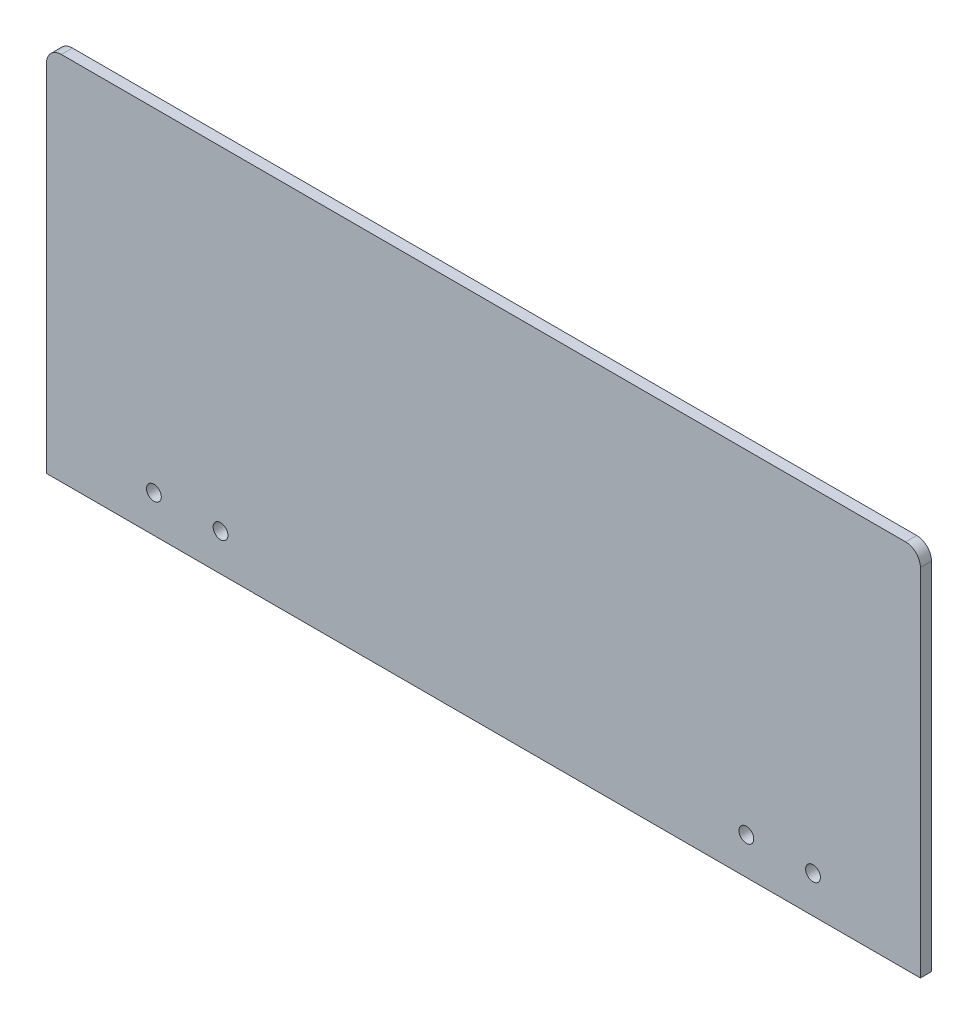
ISO-10303-21;
HEADER;
FILE_DESCRIPTION(('STEP AP214'),'2;1');
FILE_NAME('part.step','',(''),(''),'','','');
FILE_SCHEMA(('AUTOMOTIVE_DESIGN { 1 0 10303 214 1 1 1 1 }'));
ENDSEC;
DATA;
#1=APPLICATION_CONTEXT('core data for automotive mechanical design processes');
#2=APPLICATION_PROTOCOL_DEFINITION('international standard','automotive_design',2000,#1);
#3=PRODUCT_CONTEXT('',#1,'mechanical');
#4=PRODUCT('Part','Part','',(#3));
#5=PRODUCT_RELATED_PRODUCT_CATEGORY('part','',(#4));
#6=PRODUCT_DEFINITION_FORMATION('','',#4);
#7=PRODUCT_DEFINITION_CONTEXT('part definition',#1,'design');
#8=PRODUCT_DEFINITION('design','',#6,#7);
#9=PRODUCT_DEFINITION_SHAPE('','',#8);
#10=(LENGTH_UNIT() NAMED_UNIT(*) SI_UNIT(.MILLI.,.METRE.));
#11=(NAMED_UNIT(*) PLANE_ANGLE_UNIT() SI_UNIT($,.RADIAN.));
#12=(NAMED_UNIT(*) SI_UNIT($,.STERADIAN.) SOLID_ANGLE_UNIT());
#13=UNCERTAINTY_MEASURE_WITH_UNIT(LENGTH_MEASURE(1.E-05),#10,'distance_accuracy_value','');
#14=(GEOMETRIC_REPRESENTATION_CONTEXT(3) GLOBAL_UNCERTAINTY_ASSIGNED_CONTEXT((#13)) GLOBAL_UNIT_ASSIGNED_CONTEXT((#10,
#11,#12)) REPRESENTATION_CONTEXT('',''));
#15=CARTESIAN_POINT('',(0.,0.,0.));
#16=DIRECTION('',(0.,0.,1.));
#17=DIRECTION('',(1.,0.,0.));
#18=AXIS2_PLACEMENT_3D('',#15,#16,#17);
#19=CARTESIAN_POINT('',(-118.,-55.,3.));
#20=DIRECTION('',(1.,0.,0.));
#21=DIRECTION('',(0.,1.,0.));
#22=AXIS2_PLACEMENT_3D('',#19,#20,#21);
#23=PLANE('',#22);
#24=DIRECTION('',(0.,-1.,0.));
#25=VECTOR('',#24,1.);
#26=CARTESIAN_POINT('',(-118.,-55.,3.));
#27=LINE('',#26,#25);
#28=CARTESIAN_POINT('',(-118.,-59.,3.));
#29=VERTEX_POINT('',#28);
#30=CARTESIAN_POINT('',(-118.,-155.,3.));
#31=VERTEX_POINT('',#30);
#32=EDGE_CURVE('E92',#29,#31,#27,.T.);
#33=ORIENTED_EDGE('',*,*,#32,.F.);
#34=DIRECTION('',(0.,0.,-1.));
#35=VECTOR('',#34,1.);
#36=CARTESIAN_POINT('',(-118.,-59.,3.));
#37=LINE('',#36,#35);
#38=CARTESIAN_POINT('',(-118.,-59.,0.));
#39=VERTEX_POINT('',#38);
#40=EDGE_CURVE('E11',#29,#39,#37,.T.);
#41=ORIENTED_EDGE('',*,*,#40,.T.);
#42=DIRECTION('',(0.,-1.,0.));
#43=VECTOR('',#42,1.);
#44=CARTESIAN_POINT('',(-118.,-55.,0.));
#45=LINE('',#44,#43);
#46=CARTESIAN_POINT('',(-118.,-155.,0.));
#47=VERTEX_POINT('',#46);
#48=EDGE_CURVE('E111',#39,#47,#45,.T.);
#49=ORIENTED_EDGE('',*,*,#48,.T.);
#50=DIRECTION('',(0.,0.,-1.));
#51=VECTOR('',#50,1.);
#52=CARTESIAN_POINT('',(-118.,-155.,3.));
#53=LINE('',#52,#51);
#54=EDGE_CURVE('E105',#31,#47,#53,.T.);
#55=ORIENTED_EDGE('',*,*,#54,.F.);
#56=EDGE_LOOP('',(#33,#41,#49,#55));
#57=FACE_BOUND('',#56,.T.);
#58=ADVANCED_FACE('F39',(#57),#23,.F.);
#59=CARTESIAN_POINT('',(118.,-155.,3.));
#60=DIRECTION('',(0.,1.,0.));
#61=DIRECTION('',(-1.,0.,0.));
#62=AXIS2_PLACEMENT_3D('',#59,#60,#61);
#63=PLANE('',#62);
#64=DIRECTION('',(1.,0.,0.));
#65=VECTOR('',#64,1.);
#66=CARTESIAN_POINT('',(118.,-155.,0.));
#67=LINE('',#66,#65);
#68=CARTESIAN_POINT('',(118.,-155.,0.));
#69=VERTEX_POINT('',#68);
#70=EDGE_CURVE('E144',#47,#69,#67,.T.);
#71=ORIENTED_EDGE('',*,*,#70,.T.);
#72=DIRECTION('',(0.,0.,-1.));
#73=VECTOR('',#72,1.);
#74=CARTESIAN_POINT('',(118.,-155.,3.));
#75=LINE('',#74,#73);
#76=CARTESIAN_POINT('',(118.,-155.,3.));
#77=VERTEX_POINT('',#76);
#78=EDGE_CURVE('E107',#77,#69,#75,.T.);
#79=ORIENTED_EDGE('',*,*,#78,.F.);
#80=DIRECTION('',(1.,0.,0.));
#81=VECTOR('',#80,1.);
#82=CARTESIAN_POINT('',(118.,-155.,3.));
#83=LINE('',#82,#81);
#84=EDGE_CURVE('E95',#31,#77,#83,.T.);
#85=ORIENTED_EDGE('',*,*,#84,.F.);
#86=ORIENTED_EDGE('',*,*,#54,.T.);
#87=EDGE_LOOP('',(#71,#79,#85,#86));
#88=FACE_BOUND('',#87,.T.);
#89=ADVANCED_FACE('F104',(#88),#63,.F.);
#90=CARTESIAN_POINT('',(118.,-55.,3.));
#91=DIRECTION('',(-1.,0.,0.));
#92=DIRECTION('',(0.,-1.,0.));
#93=AXIS2_PLACEMENT_3D('',#90,#91,#92);
#94=PLANE('',#93);
#95=DIRECTION('',(0.,1.,0.));
#96=VECTOR('',#95,1.);
#97=CARTESIAN_POINT('',(118.,-55.,0.));
#98=LINE('',#97,#96);
#99=CARTESIAN_POINT('',(118.,-59.,0.));
#100=VERTEX_POINT('',#99);
#101=EDGE_CURVE('E142',#69,#100,#98,.T.);
#102=ORIENTED_EDGE('',*,*,#101,.T.);
#103=DIRECTION('',(0.,0.,-1.));
#104=VECTOR('',#103,1.);
#105=CARTESIAN_POINT('',(118.,-59.,3.));
#106=LINE('',#105,#104);
#107=CARTESIAN_POINT('',(118.,-59.,3.));
#108=VERTEX_POINT('',#107);
#109=EDGE_CURVE('E62',#100,#108,#106,.F.);
#110=ORIENTED_EDGE('',*,*,#109,.T.);
#111=DIRECTION('',(0.,1.,0.));
#112=VECTOR('',#111,1.);
#113=CARTESIAN_POINT('',(118.,-55.,3.));
#114=LINE('',#113,#112);
#115=EDGE_CURVE('E108',#77,#108,#114,.T.);
#116=ORIENTED_EDGE('',*,*,#115,.F.);
#117=ORIENTED_EDGE('',*,*,#78,.T.);
#118=EDGE_LOOP('',(#102,#110,#116,#117));
#119=FACE_BOUND('',#118,.T.);
#120=ADVANCED_FACE('F143',(#119),#94,.F.);
#121=CARTESIAN_POINT('',(-118.,-55.,3.));
#122=DIRECTION('',(0.,-1.,0.));
#123=DIRECTION('',(0.,0.,-1.));
#124=AXIS2_PLACEMENT_3D('',#121,#122,#123);
#125=PLANE('',#124);
#126=DIRECTION('',(-1.,0.,0.));
#127=VECTOR('',#126,1.);
#128=CARTESIAN_POINT('',(-118.,-55.,3.));
#129=LINE('',#128,#127);
#130=CARTESIAN_POINT('',(114.,-55.,3.));
#131=VERTEX_POINT('',#130);
#132=CARTESIAN_POINT('',(-114.,-55.,3.));
#133=VERTEX_POINT('',#132);
#134=EDGE_CURVE('E117',#131,#133,#129,.T.);
#135=ORIENTED_EDGE('',*,*,#134,.F.);
#136=DIRECTION('',(0.,0.,-1.));
#137=VECTOR('',#136,1.);
#138=CARTESIAN_POINT('',(114.,-55.,3.));
#139=LINE('',#138,#137);
#140=CARTESIAN_POINT('',(114.,-55.,0.));
#141=VERTEX_POINT('',#140);
#142=EDGE_CURVE('E115',#131,#141,#139,.T.);
#143=ORIENTED_EDGE('',*,*,#142,.T.);
#144=DIRECTION('',(-1.,0.,0.));
#145=VECTOR('',#144,1.);
#146=CARTESIAN_POINT('',(-118.,-55.,0.));
#147=LINE('',#146,#145);
#148=CARTESIAN_POINT('',(-114.,-55.,0.));
#149=VERTEX_POINT('',#148);
#150=EDGE_CURVE('E100',#141,#149,#147,.T.);
#151=ORIENTED_EDGE('',*,*,#150,.T.);
#152=DIRECTION('',(0.,0.,-1.));
#153=VECTOR('',#152,1.);
#154=CARTESIAN_POINT('',(-114.,-55.,3.));
#155=LINE('',#154,#153);
#156=EDGE_CURVE('E113',#149,#133,#155,.F.);
#157=ORIENTED_EDGE('',*,*,#156,.T.);
#158=EDGE_LOOP('',(#135,#143,#151,#157));
#159=FACE_BOUND('',#158,.T.);
#160=ADVANCED_FACE('F133',(#159),#125,.F.);
#161=CARTESIAN_POINT('',(0.,0.,3.));
#162=DIRECTION('',(0.,0.,-1.));
#163=DIRECTION('',(-1.,0.,0.));
#164=AXIS2_PLACEMENT_3D('',#161,#162,#163);
#165=PLANE('',#164);
#166=CARTESIAN_POINT('',(71.,-145.,3.));
#167=DIRECTION('',(0.,0.,-1.));
#168=DIRECTION('',(-1.,0.,0.));
#169=AXIS2_PLACEMENT_3D('',#166,#167,#168);
#170=CIRCLE('',#169,2.);
#171=CARTESIAN_POINT('',(73.,-145.,3.));
#172=VERTEX_POINT('',#171);
#173=EDGE_CURVE('E166',#172,#172,#170,.T.);
#174=ORIENTED_EDGE('',*,*,#173,.T.);
#175=EDGE_LOOP('',(#174));
#176=FACE_BOUND('',#175,.T.);
#177=CARTESIAN_POINT('',(89.,-145.,3.));
#178=DIRECTION('',(0.,0.,-1.));
#179=DIRECTION('',(-1.,0.,0.));
#180=AXIS2_PLACEMENT_3D('',#177,#178,#179);
#181=CIRCLE('',#180,2.);
#182=CARTESIAN_POINT('',(91.,-145.,3.));
#183=VERTEX_POINT('',#182);
#184=EDGE_CURVE('E167',#183,#183,#181,.T.);
#185=ORIENTED_EDGE('',*,*,#184,.T.);
#186=EDGE_LOOP('',(#185));
#187=FACE_BOUND('',#186,.T.);
#188=CARTESIAN_POINT('',(-71.,-145.,3.));
#189=DIRECTION('',(0.,0.,1.));
#190=DIRECTION('',(1.,0.,0.));
#191=AXIS2_PLACEMENT_3D('',#188,#189,#190);
#192=CIRCLE('',#191,2.);
#193=CARTESIAN_POINT('',(-69.,-145.,3.));
#194=VERTEX_POINT('',#193);
#195=EDGE_CURVE('E148',#194,#194,#192,.T.);
#196=ORIENTED_EDGE('',*,*,#195,.F.);
#197=EDGE_LOOP('',(#196));
#198=FACE_BOUND('',#197,.T.);
#199=CARTESIAN_POINT('',(-89.,-145.,3.));
#200=DIRECTION('',(0.,0.,1.));
#201=DIRECTION('',(1.,0.,0.));
#202=AXIS2_PLACEMENT_3D('',#199,#200,#201);
#203=CIRCLE('',#202,2.);
#204=CARTESIAN_POINT('',(-87.,-145.,3.));
#205=VERTEX_POINT('',#204);
#206=EDGE_CURVE('E154',#205,#205,#203,.T.);
#207=ORIENTED_EDGE('',*,*,#206,.F.);
#208=EDGE_LOOP('',(#207));
#209=FACE_BOUND('',#208,.T.);
#210=ORIENTED_EDGE('',*,*,#115,.T.);
#211=CARTESIAN_POINT('',(114.,-59.,3.));
#212=DIRECTION('',(0.,0.,-1.));
#213=DIRECTION('',(-1.,0.,0.));
#214=AXIS2_PLACEMENT_3D('',#211,#212,#213);
#215=CIRCLE('',#214,4.);
#216=EDGE_CURVE('E47',#108,#131,#215,.F.);
#217=ORIENTED_EDGE('',*,*,#216,.T.);
#218=ORIENTED_EDGE('',*,*,#134,.T.);
#219=CARTESIAN_POINT('',(-114.,-59.,3.));
#220=DIRECTION('',(0.,0.,-1.));
#221=DIRECTION('',(-1.,0.,0.));
#222=AXIS2_PLACEMENT_3D('',#219,#220,#221);
#223=CIRCLE('',#222,4.);
#224=EDGE_CURVE('E54',#133,#29,#223,.F.);
#225=ORIENTED_EDGE('',*,*,#224,.T.);
#226=ORIENTED_EDGE('',*,*,#32,.T.);
#227=ORIENTED_EDGE('',*,*,#84,.T.);
#228=EDGE_LOOP('',(#210,#217,#218,#225,#226,#227));
#229=FACE_BOUND('',#228,.T.);
#230=ADVANCED_FACE('F94',(#176,#187,#198,#209,#229),#165,.F.);
#231=CARTESIAN_POINT('',(0.,0.,0.));
#232=DIRECTION('',(0.,0.,-1.));
#233=DIRECTION('',(-1.,0.,0.));
#234=AXIS2_PLACEMENT_3D('',#231,#232,#233);
#235=PLANE('',#234);
#236=CARTESIAN_POINT('',(71.,-145.,0.));
#237=DIRECTION('',(0.,0.,-1.));
#238=DIRECTION('',(-1.,0.,0.));
#239=AXIS2_PLACEMENT_3D('',#236,#237,#238);
#240=CIRCLE('',#239,2.);
#241=CARTESIAN_POINT('',(73.,-145.,0.));
#242=VERTEX_POINT('',#241);
#243=EDGE_CURVE('E155',#242,#242,#240,.T.);
#244=ORIENTED_EDGE('',*,*,#243,.F.);
#245=EDGE_LOOP('',(#244));
#246=FACE_BOUND('',#245,.T.);
#247=CARTESIAN_POINT('',(89.,-145.,0.));
#248=DIRECTION('',(0.,0.,-1.));
#249=DIRECTION('',(-1.,0.,0.));
#250=AXIS2_PLACEMENT_3D('',#247,#248,#249);
#251=CIRCLE('',#250,2.);
#252=CARTESIAN_POINT('',(91.,-145.,0.));
#253=VERTEX_POINT('',#252);
#254=EDGE_CURVE('E163',#253,#253,#251,.T.);
#255=ORIENTED_EDGE('',*,*,#254,.F.);
#256=EDGE_LOOP('',(#255));
#257=FACE_BOUND('',#256,.T.);
#258=CARTESIAN_POINT('',(-71.,-145.,0.));
#259=DIRECTION('',(0.,0.,-1.));
#260=DIRECTION('',(-1.,0.,0.));
#261=AXIS2_PLACEMENT_3D('',#258,#259,#260);
#262=CIRCLE('',#261,2.);
#263=CARTESIAN_POINT('',(-69.,-145.,0.));
#264=VERTEX_POINT('',#263);
#265=EDGE_CURVE('E158',#264,#264,#262,.F.);
#266=ORIENTED_EDGE('',*,*,#265,.T.);
#267=EDGE_LOOP('',(#266));
#268=FACE_BOUND('',#267,.T.);
#269=CARTESIAN_POINT('',(-89.,-145.,0.));
#270=DIRECTION('',(0.,0.,-1.));
#271=DIRECTION('',(-1.,0.,0.));
#272=AXIS2_PLACEMENT_3D('',#269,#270,#271);
#273=CIRCLE('',#272,2.);
#274=CARTESIAN_POINT('',(-87.,-145.,0.));
#275=VERTEX_POINT('',#274);
#276=EDGE_CURVE('E151',#275,#275,#273,.F.);
#277=ORIENTED_EDGE('',*,*,#276,.T.);
#278=EDGE_LOOP('',(#277));
#279=FACE_BOUND('',#278,.T.);
#280=ORIENTED_EDGE('',*,*,#150,.F.);
#281=CARTESIAN_POINT('',(114.,-59.,0.));
#282=DIRECTION('',(0.,0.,-1.));
#283=DIRECTION('',(-1.,0.,0.));
#284=AXIS2_PLACEMENT_3D('',#281,#282,#283);
#285=CIRCLE('',#284,4.);
#286=EDGE_CURVE('E125',#141,#100,#285,.T.);
#287=ORIENTED_EDGE('',*,*,#286,.T.);
#288=ORIENTED_EDGE('',*,*,#101,.F.);
#289=ORIENTED_EDGE('',*,*,#70,.F.);
#290=ORIENTED_EDGE('',*,*,#48,.F.);
#291=CARTESIAN_POINT('',(-114.,-59.,0.));
#292=DIRECTION('',(0.,0.,-1.));
#293=DIRECTION('',(-1.,0.,0.));
#294=AXIS2_PLACEMENT_3D('',#291,#292,#293);
#295=CIRCLE('',#294,4.);
#296=EDGE_CURVE('E123',#39,#149,#295,.T.);
#297=ORIENTED_EDGE('',*,*,#296,.T.);
#298=EDGE_LOOP('',(#280,#287,#288,#289,#290,#297));
#299=FACE_BOUND('',#298,.T.);
#300=ADVANCED_FACE('F141',(#246,#257,#268,#279,#299),#235,.T.);
#301=CARTESIAN_POINT('',(-89.,-145.,-0.00100000000000013));
#302=DIRECTION('',(0.,0.,1.));
#303=DIRECTION('',(1.,0.,0.));
#304=AXIS2_PLACEMENT_3D('',#301,#302,#303);
#305=CYLINDRICAL_SURFACE('',#304,2.);
#306=CARTESIAN_POINT('',(-87.,-145.,0.));
#307=CARTESIAN_POINT('',(-87.,-145.,0.03125));
#308=CARTESIAN_POINT('',(-87.,-145.,0.0625));
#309=CARTESIAN_POINT('',(-87.,-145.,0.125));
#310=CARTESIAN_POINT('',(-87.,-145.,0.15625));
#311=CARTESIAN_POINT('',(-87.,-145.,0.21875));
#312=CARTESIAN_POINT('',(-87.,-145.,0.25));
#313=CARTESIAN_POINT('',(-87.,-145.,0.3125));
#314=CARTESIAN_POINT('',(-87.,-145.,0.34375));
#315=CARTESIAN_POINT('',(-87.,-145.,0.40625));
#316=CARTESIAN_POINT('',(-87.,-145.,0.4375));
#317=CARTESIAN_POINT('',(-87.,-145.,0.5));
#318=CARTESIAN_POINT('',(-87.,-145.,0.53125));
#319=CARTESIAN_POINT('',(-87.,-145.,0.59375));
#320=CARTESIAN_POINT('',(-87.,-145.,0.625));
#321=CARTESIAN_POINT('',(-87.,-145.,0.6875));
#322=CARTESIAN_POINT('',(-87.,-145.,0.71875));
#323=CARTESIAN_POINT('',(-87.,-145.,0.78125));
#324=CARTESIAN_POINT('',(-87.,-145.,0.8125));
#325=CARTESIAN_POINT('',(-87.,-145.,0.875));
#326=CARTESIAN_POINT('',(-87.,-145.,0.90625));
#327=CARTESIAN_POINT('',(-87.,-145.,0.96875));
#328=CARTESIAN_POINT('',(-87.,-145.,1.));
#329=CARTESIAN_POINT('',(-87.,-145.,1.0625));
#330=CARTESIAN_POINT('',(-87.,-145.,1.09375));
#331=CARTESIAN_POINT('',(-87.,-145.,1.15625));
#332=CARTESIAN_POINT('',(-87.,-145.,1.1875));
#333=CARTESIAN_POINT('',(-87.,-145.,1.25));
#334=CARTESIAN_POINT('',(-87.,-145.,1.28125));
#335=CARTESIAN_POINT('',(-87.,-145.,1.34375));
#336=CARTESIAN_POINT('',(-87.,-145.,1.375));
#337=CARTESIAN_POINT('',(-87.,-145.,1.4375));
#338=CARTESIAN_POINT('',(-87.,-145.,1.46875));
#339=CARTESIAN_POINT('',(-87.,-145.,1.53125));
#340=CARTESIAN_POINT('',(-87.,-145.,1.5625));
#341=CARTESIAN_POINT('',(-87.,-145.,1.625));
#342=CARTESIAN_POINT('',(-87.,-145.,1.65625));
#343=CARTESIAN_POINT('',(-87.,-145.,1.71875));
#344=CARTESIAN_POINT('',(-87.,-145.,1.75));
#345=CARTESIAN_POINT('',(-87.,-145.,1.8125));
#346=CARTESIAN_POINT('',(-87.,-145.,1.84375));
#347=CARTESIAN_POINT('',(-87.,-145.,1.90625));
#348=CARTESIAN_POINT('',(-87.,-145.,1.9375));
#349=CARTESIAN_POINT('',(-87.,-145.,2.));
#350=CARTESIAN_POINT('',(-87.,-145.,2.03125));
#351=CARTESIAN_POINT('',(-87.,-145.,2.09375));
#352=CARTESIAN_POINT('',(-87.,-145.,2.125));
#353=CARTESIAN_POINT('',(-87.,-145.,2.1875));
#354=CARTESIAN_POINT('',(-87.,-145.,2.21875));
#355=CARTESIAN_POINT('',(-87.,-145.,2.28125));
#356=CARTESIAN_POINT('',(-87.,-145.,2.3125));
#357=CARTESIAN_POINT('',(-87.,-145.,2.375));
#358=CARTESIAN_POINT('',(-87.,-145.,2.40625));
#359=CARTESIAN_POINT('',(-87.,-145.,2.46875));
#360=CARTESIAN_POINT('',(-87.,-145.,2.5));
#361=CARTESIAN_POINT('',(-87.,-145.,2.5625));
#362=CARTESIAN_POINT('',(-87.,-145.,2.59375));
#363=CARTESIAN_POINT('',(-87.,-145.,2.65625));
#364=CARTESIAN_POINT('',(-87.,-145.,2.6875));
#365=CARTESIAN_POINT('',(-87.,-145.,2.75));
#366=CARTESIAN_POINT('',(-87.,-145.,2.78125));
#367=CARTESIAN_POINT('',(-87.,-145.,2.84375));
#368=CARTESIAN_POINT('',(-87.,-145.,2.875));
#369=CARTESIAN_POINT('',(-87.,-145.,2.9375));
#370=CARTESIAN_POINT('',(-87.,-145.,2.96875));
#371=CARTESIAN_POINT('',(-87.,-145.,3.));
#372=B_SPLINE_CURVE_WITH_KNOTS('',3,(#306,#307,#308,#309,#310,#311,#312,#313,#314,#315,#316,
#317,#318,#319,#320,#321,#322,#323,#324,#325,#326,#327,#328,#329,#330,#331,#332,#333,#334,#335,
#336,#337,#338,#339,#340,#341,#342,#343,#344,#345,#346,#347,#348,#349,#350,#351,#352,#353,#354,
#355,#356,#357,#358,#359,#360,#361,#362,#363,#364,#365,#366,#367,#368,#369,#370,#371),
.UNSPECIFIED.,.F.,.F.,(4,2,2,2,2,2,2,2,2,2,2,2,2,2,2,2,2,2,2,2,2,2,2,2,2,2,2,2,2,2,2,2,4),(0.,
0.09375,0.1875,0.28125,0.375,0.46875,0.5625,0.65625,0.75,0.84375,0.9375,1.03125,1.125,1.21875,
1.3125,1.40625,1.5,1.59375,1.6875,1.78125,1.875,1.96875,2.0625,2.15625,2.25,2.34375,2.4375,
2.53125,2.625,2.71875,2.8125,2.90625,3.),.UNSPECIFIED.);
#373=EDGE_CURVE('BSEAM202',#275,#205,#372,.T.);
#374=ORIENTED_EDGE('',*,*,#276,.F.);
#375=ORIENTED_EDGE('',*,*,#206,.T.);
#376=ORIENTED_EDGE('',*,*,#373,.T.);
#377=ORIENTED_EDGE('',*,*,#373,.F.);
#378=EDGE_LOOP('',(#374,#376,#375,#377));
#379=FACE_BOUND('',#378,.T.);
#380=ADVANCED_FACE('F202',(#379),#305,.F.);
#381=CARTESIAN_POINT('',(-71.,-145.,-0.00100000000000013));
#382=DIRECTION('',(0.,0.,1.));
#383=DIRECTION('',(1.,0.,0.));
#384=AXIS2_PLACEMENT_3D('',#381,#382,#383);
#385=CYLINDRICAL_SURFACE('',#384,2.);
#386=CARTESIAN_POINT('',(-69.,-145.,0.));
#387=CARTESIAN_POINT('',(-69.,-145.,0.03125));
#388=CARTESIAN_POINT('',(-69.,-145.,0.0625));
#389=CARTESIAN_POINT('',(-69.,-145.,0.125));
#390=CARTESIAN_POINT('',(-69.,-145.,0.15625));
#391=CARTESIAN_POINT('',(-69.,-145.,0.21875));
#392=CARTESIAN_POINT('',(-69.,-145.,0.25));
#393=CARTESIAN_POINT('',(-69.,-145.,0.3125));
#394=CARTESIAN_POINT('',(-69.,-145.,0.34375));
#395=CARTESIAN_POINT('',(-69.,-145.,0.40625));
#396=CARTESIAN_POINT('',(-69.,-145.,0.4375));
#397=CARTESIAN_POINT('',(-69.,-145.,0.5));
#398=CARTESIAN_POINT('',(-69.,-145.,0.53125));
#399=CARTESIAN_POINT('',(-69.,-145.,0.59375));
#400=CARTESIAN_POINT('',(-69.,-145.,0.625));
#401=CARTESIAN_POINT('',(-69.,-145.,0.6875));
#402=CARTESIAN_POINT('',(-69.,-145.,0.71875));
#403=CARTESIAN_POINT('',(-69.,-145.,0.78125));
#404=CARTESIAN_POINT('',(-69.,-145.,0.8125));
#405=CARTESIAN_POINT('',(-69.,-145.,0.875));
#406=CARTESIAN_POINT('',(-69.,-145.,0.90625));
#407=CARTESIAN_POINT('',(-69.,-145.,0.96875));
#408=CARTESIAN_POINT('',(-69.,-145.,1.));
#409=CARTESIAN_POINT('',(-69.,-145.,1.0625));
#410=CARTESIAN_POINT('',(-69.,-145.,1.09375));
#411=CARTESIAN_POINT('',(-69.,-145.,1.15625));
#412=CARTESIAN_POINT('',(-69.,-145.,1.1875));
#413=CARTESIAN_POINT('',(-69.,-145.,1.25));
#414=CARTESIAN_POINT('',(-69.,-145.,1.28125));
#415=CARTESIAN_POINT('',(-69.,-145.,1.34375));
#416=CARTESIAN_POINT('',(-69.,-145.,1.375));
#417=CARTESIAN_POINT('',(-69.,-145.,1.4375));
#418=CARTESIAN_POINT('',(-69.,-145.,1.46875));
#419=CARTESIAN_POINT('',(-69.,-145.,1.53125));
#420=CARTESIAN_POINT('',(-69.,-145.,1.5625));
#421=CARTESIAN_POINT('',(-69.,-145.,1.625));
#422=CARTESIAN_POINT('',(-69.,-145.,1.65625));
#423=CARTESIAN_POINT('',(-69.,-145.,1.71875));
#424=CARTESIAN_POINT('',(-69.,-145.,1.75));
#425=CARTESIAN_POINT('',(-69.,-145.,1.8125));
#426=CARTESIAN_POINT('',(-69.,-145.,1.84375));
#427=CARTESIAN_POINT('',(-69.,-145.,1.90625));
#428=CARTESIAN_POINT('',(-69.,-145.,1.9375));
#429=CARTESIAN_POINT('',(-69.,-145.,2.));
#430=CARTESIAN_POINT('',(-69.,-145.,2.03125));
#431=CARTESIAN_POINT('',(-69.,-145.,2.09375));
#432=CARTESIAN_POINT('',(-69.,-145.,2.125));
#433=CARTESIAN_POINT('',(-69.,-145.,2.1875));
#434=CARTESIAN_POINT('',(-69.,-145.,2.21875));
#435=CARTESIAN_POINT('',(-69.,-145.,2.28125));
#436=CARTESIAN_POINT('',(-69.,-145.,2.3125));
#437=CARTESIAN_POINT('',(-69.,-145.,2.375));
#438=CARTESIAN_POINT('',(-69.,-145.,2.40625));
#439=CARTESIAN_POINT('',(-69.,-145.,2.46875));
#440=CARTESIAN_POINT('',(-69.,-145.,2.5));
#441=CARTESIAN_POINT('',(-69.,-145.,2.5625));
#442=CARTESIAN_POINT('',(-69.,-145.,2.59375));
#443=CARTESIAN_POINT('',(-69.,-145.,2.65625));
#444=CARTESIAN_POINT('',(-69.,-145.,2.6875));
#445=CARTESIAN_POINT('',(-69.,-145.,2.75));
#446=CARTESIAN_POINT('',(-69.,-145.,2.78125));
#447=CARTESIAN_POINT('',(-69.,-145.,2.84375));
#448=CARTESIAN_POINT('',(-69.,-145.,2.875));
#449=CARTESIAN_POINT('',(-69.,-145.,2.9375));
#450=CARTESIAN_POINT('',(-69.,-145.,2.96875));
#451=CARTESIAN_POINT('',(-69.,-145.,3.));
#452=B_SPLINE_CURVE_WITH_KNOTS('',3,(#386,#387,#388,#389,#390,#391,#392,#393,#394,#395,#396,
#397,#398,#399,#400,#401,#402,#403,#404,#405,#406,#407,#408,#409,#410,#411,#412,#413,#414,#415,
#416,#417,#418,#419,#420,#421,#422,#423,#424,#425,#426,#427,#428,#429,#430,#431,#432,#433,#434,
#435,#436,#437,#438,#439,#440,#441,#442,#443,#444,#445,#446,#447,#448,#449,#450,#451),
.UNSPECIFIED.,.F.,.F.,(4,2,2,2,2,2,2,2,2,2,2,2,2,2,2,2,2,2,2,2,2,2,2,2,2,2,2,2,2,2,2,2,4),(0.,
0.09375,0.1875,0.28125,0.375,0.46875,0.5625,0.65625,0.75,0.84375,0.9375,1.03125,1.125,1.21875,
1.3125,1.40625,1.5,1.59375,1.6875,1.78125,1.875,1.96875,2.0625,2.15625,2.25,2.34375,2.4375,
2.53125,2.625,2.71875,2.8125,2.90625,3.),.UNSPECIFIED.);
#453=EDGE_CURVE('BSEAM186',#264,#194,#452,.T.);
#454=ORIENTED_EDGE('',*,*,#265,.F.);
#455=ORIENTED_EDGE('',*,*,#195,.T.);
#456=ORIENTED_EDGE('',*,*,#453,.T.);
#457=ORIENTED_EDGE('',*,*,#453,.F.);
#458=EDGE_LOOP('',(#454,#456,#455,#457));
#459=FACE_BOUND('',#458,.T.);
#460=ADVANCED_FACE('F186',(#459),#385,.F.);
#461=CARTESIAN_POINT('',(89.,-145.,-0.00100000000000013));
#462=DIRECTION('',(0.,0.,1.));
#463=DIRECTION('',(1.,0.,0.));
#464=AXIS2_PLACEMENT_3D('',#461,#462,#463);
#465=CYLINDRICAL_SURFACE('',#464,2.);
#466=CARTESIAN_POINT('',(91.,-145.,0.));
#467=CARTESIAN_POINT('',(91.,-145.,0.03125));
#468=CARTESIAN_POINT('',(91.,-145.,0.0625));
#469=CARTESIAN_POINT('',(91.,-145.,0.125));
#470=CARTESIAN_POINT('',(91.,-145.,0.15625));
#471=CARTESIAN_POINT('',(91.,-145.,0.21875));
#472=CARTESIAN_POINT('',(91.,-145.,0.25));
#473=CARTESIAN_POINT('',(91.,-145.,0.3125));
#474=CARTESIAN_POINT('',(91.,-145.,0.34375));
#475=CARTESIAN_POINT('',(91.,-145.,0.40625));
#476=CARTESIAN_POINT('',(91.,-145.,0.4375));
#477=CARTESIAN_POINT('',(91.,-145.,0.5));
#478=CARTESIAN_POINT('',(91.,-145.,0.53125));
#479=CARTESIAN_POINT('',(91.,-145.,0.59375));
#480=CARTESIAN_POINT('',(91.,-145.,0.625));
#481=CARTESIAN_POINT('',(91.,-145.,0.6875));
#482=CARTESIAN_POINT('',(91.,-145.,0.71875));
#483=CARTESIAN_POINT('',(91.,-145.,0.78125));
#484=CARTESIAN_POINT('',(91.,-145.,0.8125));
#485=CARTESIAN_POINT('',(91.,-145.,0.875));
#486=CARTESIAN_POINT('',(91.,-145.,0.90625));
#487=CARTESIAN_POINT('',(91.,-145.,0.96875));
#488=CARTESIAN_POINT('',(91.,-145.,1.));
#489=CARTESIAN_POINT('',(91.,-145.,1.0625));
#490=CARTESIAN_POINT('',(91.,-145.,1.09375));
#491=CARTESIAN_POINT('',(91.,-145.,1.15625));
#492=CARTESIAN_POINT('',(91.,-145.,1.1875));
#493=CARTESIAN_POINT('',(91.,-145.,1.25));
#494=CARTESIAN_POINT('',(91.,-145.,1.28125));
#495=CARTESIAN_POINT('',(91.,-145.,1.34375));
#496=CARTESIAN_POINT('',(91.,-145.,1.375));
#497=CARTESIAN_POINT('',(91.,-145.,1.4375));
#498=CARTESIAN_POINT('',(91.,-145.,1.46875));
#499=CARTESIAN_POINT('',(91.,-145.,1.53125));
#500=CARTESIAN_POINT('',(91.,-145.,1.5625));
#501=CARTESIAN_POINT('',(91.,-145.,1.625));
#502=CARTESIAN_POINT('',(91.,-145.,1.65625));
#503=CARTESIAN_POINT('',(91.,-145.,1.71875));
#504=CARTESIAN_POINT('',(91.,-145.,1.75));
#505=CARTESIAN_POINT('',(91.,-145.,1.8125));
#506=CARTESIAN_POINT('',(91.,-145.,1.84375));
#507=CARTESIAN_POINT('',(91.,-145.,1.90625));
#508=CARTESIAN_POINT('',(91.,-145.,1.9375));
#509=CARTESIAN_POINT('',(91.,-145.,2.));
#510=CARTESIAN_POINT('',(91.,-145.,2.03125));
#511=CARTESIAN_POINT('',(91.,-145.,2.09375));
#512=CARTESIAN_POINT('',(91.,-145.,2.125));
#513=CARTESIAN_POINT('',(91.,-145.,2.1875));
#514=CARTESIAN_POINT('',(91.,-145.,2.21875));
#515=CARTESIAN_POINT('',(91.,-145.,2.28125));
#516=CARTESIAN_POINT('',(91.,-145.,2.3125));
#517=CARTESIAN_POINT('',(91.,-145.,2.375));
#518=CARTESIAN_POINT('',(91.,-145.,2.40625));
#519=CARTESIAN_POINT('',(91.,-145.,2.46875));
#520=CARTESIAN_POINT('',(91.,-145.,2.5));
#521=CARTESIAN_POINT('',(91.,-145.,2.5625));
#522=CARTESIAN_POINT('',(91.,-145.,2.59375));
#523=CARTESIAN_POINT('',(91.,-145.,2.65625));
#524=CARTESIAN_POINT('',(91.,-145.,2.6875));
#525=CARTESIAN_POINT('',(91.,-145.,2.75));
#526=CARTESIAN_POINT('',(91.,-145.,2.78125));
#527=CARTESIAN_POINT('',(91.,-145.,2.84375));
#528=CARTESIAN_POINT('',(91.,-145.,2.875));
#529=CARTESIAN_POINT('',(91.,-145.,2.9375));
#530=CARTESIAN_POINT('',(91.,-145.,2.96875));
#531=CARTESIAN_POINT('',(91.,-145.,3.));
#532=B_SPLINE_CURVE_WITH_KNOTS('',3,(#466,#467,#468,#469,#470,#471,#472,#473,#474,#475,#476,
#477,#478,#479,#480,#481,#482,#483,#484,#485,#486,#487,#488,#489,#490,#491,#492,#493,#494,#495,
#496,#497,#498,#499,#500,#501,#502,#503,#504,#505,#506,#507,#508,#509,#510,#511,#512,#513,#514,
#515,#516,#517,#518,#519,#520,#521,#522,#523,#524,#525,#526,#527,#528,#529,#530,#531),
.UNSPECIFIED.,.F.,.F.,(4,2,2,2,2,2,2,2,2,2,2,2,2,2,2,2,2,2,2,2,2,2,2,2,2,2,2,2,2,2,2,2,4),(0.,
0.09375,0.1875,0.28125,0.375,0.46875,0.5625,0.65625,0.75,0.84375,0.9375,1.03125,1.125,1.21875,
1.3125,1.40625,1.5,1.59375,1.6875,1.78125,1.875,1.96875,2.0625,2.15625,2.25,2.34375,2.4375,
2.53125,2.625,2.71875,2.8125,2.90625,3.),.UNSPECIFIED.);
#533=EDGE_CURVE('BSEAM179',#253,#183,#532,.T.);
#534=ORIENTED_EDGE('',*,*,#254,.T.);
#535=ORIENTED_EDGE('',*,*,#184,.F.);
#536=ORIENTED_EDGE('',*,*,#533,.T.);
#537=ORIENTED_EDGE('',*,*,#533,.F.);
#538=EDGE_LOOP('',(#534,#536,#535,#537));
#539=FACE_BOUND('',#538,.T.);
#540=ADVANCED_FACE('F179',(#539),#465,.F.);
#541=CARTESIAN_POINT('',(71.,-145.,-0.00100000000000013));
#542=DIRECTION('',(0.,0.,1.));
#543=DIRECTION('',(1.,0.,0.));
#544=AXIS2_PLACEMENT_3D('',#541,#542,#543);
#545=CYLINDRICAL_SURFACE('',#544,2.);
#546=CARTESIAN_POINT('',(73.,-145.,0.));
#547=CARTESIAN_POINT('',(73.,-145.,0.03125));
#548=CARTESIAN_POINT('',(73.,-145.,0.0625));
#549=CARTESIAN_POINT('',(73.,-145.,0.125));
#550=CARTESIAN_POINT('',(73.,-145.,0.15625));
#551=CARTESIAN_POINT('',(73.,-145.,0.21875));
#552=CARTESIAN_POINT('',(73.,-145.,0.25));
#553=CARTESIAN_POINT('',(73.,-145.,0.3125));
#554=CARTESIAN_POINT('',(73.,-145.,0.34375));
#555=CARTESIAN_POINT('',(73.,-145.,0.40625));
#556=CARTESIAN_POINT('',(73.,-145.,0.4375));
#557=CARTESIAN_POINT('',(73.,-145.,0.5));
#558=CARTESIAN_POINT('',(73.,-145.,0.53125));
#559=CARTESIAN_POINT('',(73.,-145.,0.59375));
#560=CARTESIAN_POINT('',(73.,-145.,0.625));
#561=CARTESIAN_POINT('',(73.,-145.,0.6875));
#562=CARTESIAN_POINT('',(73.,-145.,0.71875));
#563=CARTESIAN_POINT('',(73.,-145.,0.78125));
#564=CARTESIAN_POINT('',(73.,-145.,0.8125));
#565=CARTESIAN_POINT('',(73.,-145.,0.875));
#566=CARTESIAN_POINT('',(73.,-145.,0.90625));
#567=CARTESIAN_POINT('',(73.,-145.,0.96875));
#568=CARTESIAN_POINT('',(73.,-145.,1.));
#569=CARTESIAN_POINT('',(73.,-145.,1.0625));
#570=CARTESIAN_POINT('',(73.,-145.,1.09375));
#571=CARTESIAN_POINT('',(73.,-145.,1.15625));
#572=CARTESIAN_POINT('',(73.,-145.,1.1875));
#573=CARTESIAN_POINT('',(73.,-145.,1.25));
#574=CARTESIAN_POINT('',(73.,-145.,1.28125));
#575=CARTESIAN_POINT('',(73.,-145.,1.34375));
#576=CARTESIAN_POINT('',(73.,-145.,1.375));
#577=CARTESIAN_POINT('',(73.,-145.,1.4375));
#578=CARTESIAN_POINT('',(73.,-145.,1.46875));
#579=CARTESIAN_POINT('',(73.,-145.,1.53125));
#580=CARTESIAN_POINT('',(73.,-145.,1.5625));
#581=CARTESIAN_POINT('',(73.,-145.,1.625));
#582=CARTESIAN_POINT('',(73.,-145.,1.65625));
#583=CARTESIAN_POINT('',(73.,-145.,1.71875));
#584=CARTESIAN_POINT('',(73.,-145.,1.75));
#585=CARTESIAN_POINT('',(73.,-145.,1.8125));
#586=CARTESIAN_POINT('',(73.,-145.,1.84375));
#587=CARTESIAN_POINT('',(73.,-145.,1.90625));
#588=CARTESIAN_POINT('',(73.,-145.,1.9375));
#589=CARTESIAN_POINT('',(73.,-145.,2.));
#590=CARTESIAN_POINT('',(73.,-145.,2.03125));
#591=CARTESIAN_POINT('',(73.,-145.,2.09375));
#592=CARTESIAN_POINT('',(73.,-145.,2.125));
#593=CARTESIAN_POINT('',(73.,-145.,2.1875));
#594=CARTESIAN_POINT('',(73.,-145.,2.21875));
#595=CARTESIAN_POINT('',(73.,-145.,2.28125));
#596=CARTESIAN_POINT('',(73.,-145.,2.3125));
#597=CARTESIAN_POINT('',(73.,-145.,2.375));
#598=CARTESIAN_POINT('',(73.,-145.,2.40625));
#599=CARTESIAN_POINT('',(73.,-145.,2.46875));
#600=CARTESIAN_POINT('',(73.,-145.,2.5));
#601=CARTESIAN_POINT('',(73.,-145.,2.5625));
#602=CARTESIAN_POINT('',(73.,-145.,2.59375));
#603=CARTESIAN_POINT('',(73.,-145.,2.65625));
#604=CARTESIAN_POINT('',(73.,-145.,2.6875));
#605=CARTESIAN_POINT('',(73.,-145.,2.75));
#606=CARTESIAN_POINT('',(73.,-145.,2.78125));
#607=CARTESIAN_POINT('',(73.,-145.,2.84375));
#608=CARTESIAN_POINT('',(73.,-145.,2.875));
#609=CARTESIAN_POINT('',(73.,-145.,2.9375));
#610=CARTESIAN_POINT('',(73.,-145.,2.96875));
#611=CARTESIAN_POINT('',(73.,-145.,3.));
#612=B_SPLINE_CURVE_WITH_KNOTS('',3,(#546,#547,#548,#549,#550,#551,#552,#553,#554,#555,#556,
#557,#558,#559,#560,#561,#562,#563,#564,#565,#566,#567,#568,#569,#570,#571,#572,#573,#574,#575,
#576,#577,#578,#579,#580,#581,#582,#583,#584,#585,#586,#587,#588,#589,#590,#591,#592,#593,#594,
#595,#596,#597,#598,#599,#600,#601,#602,#603,#604,#605,#606,#607,#608,#609,#610,#611),
.UNSPECIFIED.,.F.,.F.,(4,2,2,2,2,2,2,2,2,2,2,2,2,2,2,2,2,2,2,2,2,2,2,2,2,2,2,2,2,2,2,2,4),(0.,
0.09375,0.1875,0.28125,0.375,0.46875,0.5625,0.65625,0.75,0.84375,0.9375,1.03125,1.125,1.21875,
1.3125,1.40625,1.5,1.59375,1.6875,1.78125,1.875,1.96875,2.0625,2.15625,2.25,2.34375,2.4375,
2.53125,2.625,2.71875,2.8125,2.90625,3.),.UNSPECIFIED.);
#613=EDGE_CURVE('BSEAM177',#242,#172,#612,.T.);
#614=ORIENTED_EDGE('',*,*,#243,.T.);
#615=ORIENTED_EDGE('',*,*,#173,.F.);
#616=ORIENTED_EDGE('',*,*,#613,.T.);
#617=ORIENTED_EDGE('',*,*,#613,.F.);
#618=EDGE_LOOP('',(#614,#616,#615,#617));
#619=FACE_BOUND('',#618,.T.);
#620=ADVANCED_FACE('F177',(#619),#545,.F.);
#621=CARTESIAN_POINT('',(114.,-59.,3.));
#622=DIRECTION('',(0.,0.,-1.));
#623=DIRECTION('',(-1.,0.,0.));
#624=AXIS2_PLACEMENT_3D('',#621,#622,#623);
#625=CYLINDRICAL_SURFACE('',#624,4.);
#626=ORIENTED_EDGE('',*,*,#216,.F.);
#627=ORIENTED_EDGE('',*,*,#109,.F.);
#628=ORIENTED_EDGE('',*,*,#286,.F.);
#629=ORIENTED_EDGE('',*,*,#142,.F.);
#630=EDGE_LOOP('',(#626,#627,#628,#629));
#631=FACE_BOUND('',#630,.T.);
#632=ADVANCED_FACE('F138',(#631),#625,.T.);
#633=CARTESIAN_POINT('',(-114.,-59.,3.));
#634=DIRECTION('',(0.,0.,-1.));
#635=DIRECTION('',(-1.,0.,0.));
#636=AXIS2_PLACEMENT_3D('',#633,#634,#635);
#637=CYLINDRICAL_SURFACE('',#636,4.);
#638=ORIENTED_EDGE('',*,*,#224,.F.);
#639=ORIENTED_EDGE('',*,*,#156,.F.);
#640=ORIENTED_EDGE('',*,*,#296,.F.);
#641=ORIENTED_EDGE('',*,*,#40,.F.);
#642=EDGE_LOOP('',(#638,#639,#640,#641));
#643=FACE_BOUND('',#642,.T.);
#644=ADVANCED_FACE('F41',(#643),#637,.T.);
#645=CLOSED_SHELL('',(#58,#89,#120,#160,#230,#300,#380,#460,#540,#620,#632,#644));
#646=MANIFOLD_SOLID_BREP('B2',#645);
#647=ADVANCED_BREP_SHAPE_REPRESENTATION('',(#18,#646),#14);
#648=SHAPE_DEFINITION_REPRESENTATION(#9,#647);
ENDSEC;
END-ISO-10303-21;
